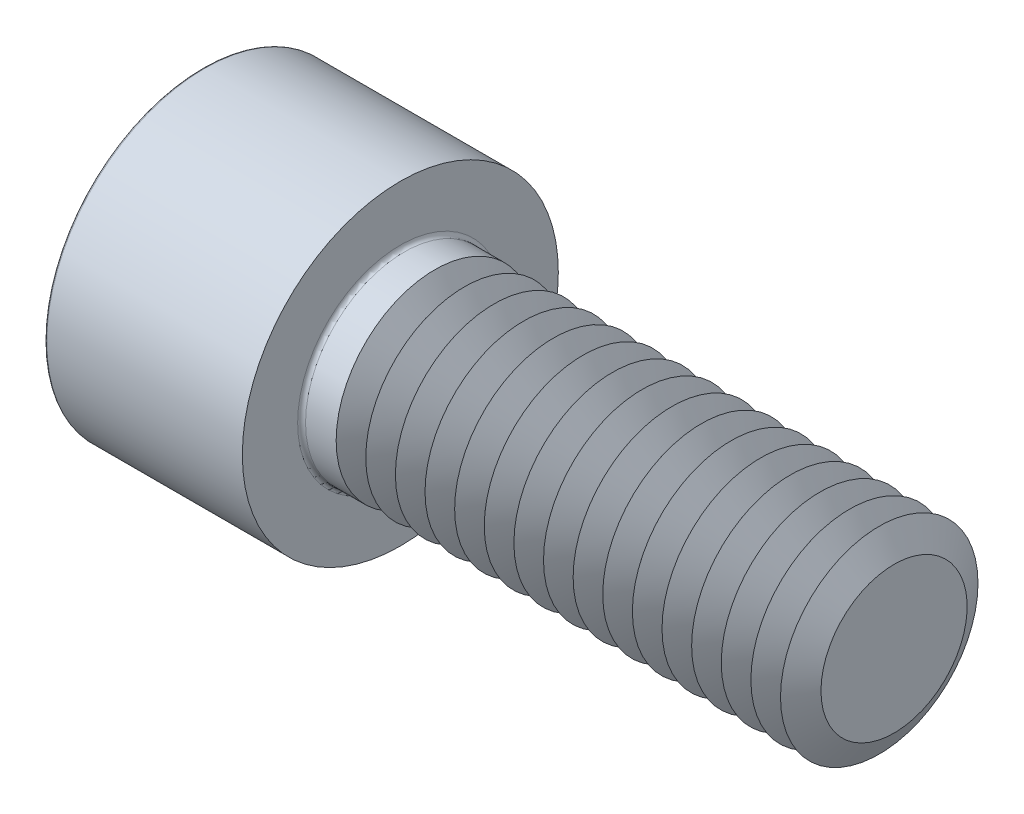
ISO-10303-21;
HEADER;
FILE_DESCRIPTION(('STEP AP214'),'2;1');
FILE_NAME('part.step','',(''),(''),'','','');
FILE_SCHEMA(('AUTOMOTIVE_DESIGN { 1 0 10303 214 1 1 1 1 }'));
ENDSEC;
DATA;
#1=APPLICATION_CONTEXT('core data for automotive mechanical design processes');
#2=APPLICATION_PROTOCOL_DEFINITION('international standard','automotive_design',2000,#1);
#3=PRODUCT_CONTEXT('',#1,'mechanical');
#4=PRODUCT('Part','Part','',(#3));
#5=PRODUCT_RELATED_PRODUCT_CATEGORY('part','',(#4));
#6=PRODUCT_DEFINITION_FORMATION('','',#4);
#7=PRODUCT_DEFINITION_CONTEXT('part definition',#1,'design');
#8=PRODUCT_DEFINITION('design','',#6,#7);
#9=PRODUCT_DEFINITION_SHAPE('','',#8);
#10=(LENGTH_UNIT() NAMED_UNIT(*) SI_UNIT(.MILLI.,.METRE.));
#11=(NAMED_UNIT(*) PLANE_ANGLE_UNIT() SI_UNIT($,.RADIAN.));
#12=(NAMED_UNIT(*) SI_UNIT($,.STERADIAN.) SOLID_ANGLE_UNIT());
#13=UNCERTAINTY_MEASURE_WITH_UNIT(LENGTH_MEASURE(1.E-05),#10,'distance_accuracy_value','');
#14=(GEOMETRIC_REPRESENTATION_CONTEXT(3) GLOBAL_UNCERTAINTY_ASSIGNED_CONTEXT((#13)) GLOBAL_UNIT_ASSIGNED_CONTEXT((#10,
#11,#12)) REPRESENTATION_CONTEXT('',''));
#15=CARTESIAN_POINT('',(0.,0.,0.));
#16=DIRECTION('',(0.,0.,1.));
#17=DIRECTION('',(1.,0.,0.));
#18=AXIS2_PLACEMENT_3D('',#15,#16,#17);
#19=CARTESIAN_POINT('',(0.,0.,0.));
#20=DIRECTION('',(-1.,0.,0.));
#21=DIRECTION('',(0.,0.,1.));
#22=AXIS2_PLACEMENT_3D('',#19,#20,#21);
#23=CYLINDRICAL_SURFACE('',#22,5.);
#24=CARTESIAN_POINT('',(13.2500220003227,0.,0.));
#25=DIRECTION('',(-1.,0.,0.));
#26=DIRECTION('',(0.,0.,1.));
#27=AXIS2_PLACEMENT_3D('',#24,#25,#26);
#28=CIRCLE('',#27,5.);
#29=CARTESIAN_POINT('',(13.2500220003227,0.,5.));
#30=VERTEX_POINT('',#29);
#31=EDGE_CURVE('E356',#30,#30,#28,.T.);
#32=ORIENTED_EDGE('',*,*,#31,.T.);
#33=EDGE_LOOP('',(#32));
#34=FACE_BOUND('',#33,.T.);
#35=CARTESIAN_POINT('',(13.2499779996774,0.,0.));
#36=DIRECTION('',(-1.,0.,0.));
#37=DIRECTION('',(0.,0.,1.));
#38=AXIS2_PLACEMENT_3D('',#35,#36,#37);
#39=CIRCLE('',#38,5.);
#40=CARTESIAN_POINT('',(13.2499779996774,0.,5.));
#41=VERTEX_POINT('',#40);
#42=EDGE_CURVE('E352',#41,#41,#39,.T.);
#43=ORIENTED_EDGE('',*,*,#42,.F.);
#44=EDGE_LOOP('',(#43));
#45=FACE_BOUND('',#44,.T.);
#46=ADVANCED_FACE('F39',(#34,#45),#23,.T.);
#47=CARTESIAN_POINT('',(14.7500220003227,0.,0.));
#48=DIRECTION('',(-1.,0.,0.));
#49=DIRECTION('',(0.,0.,1.));
#50=AXIS2_PLACEMENT_3D('',#47,#48,#49);
#51=CIRCLE('',#50,5.);
#52=CARTESIAN_POINT('',(14.7500220003227,0.,5.));
#53=VERTEX_POINT('',#52);
#54=EDGE_CURVE('E369',#53,#53,#51,.T.);
#55=ORIENTED_EDGE('',*,*,#54,.T.);
#56=EDGE_LOOP('',(#55));
#57=FACE_BOUND('',#56,.T.);
#58=CARTESIAN_POINT('',(14.7499779996773,0.,0.));
#59=DIRECTION('',(-1.,0.,0.));
#60=DIRECTION('',(0.,0.,1.));
#61=AXIS2_PLACEMENT_3D('',#58,#59,#60);
#62=CIRCLE('',#61,5.);
#63=CARTESIAN_POINT('',(14.7499779996773,0.,5.));
#64=VERTEX_POINT('',#63);
#65=EDGE_CURVE('E358',#64,#64,#62,.T.);
#66=ORIENTED_EDGE('',*,*,#65,.F.);
#67=EDGE_LOOP('',(#66));
#68=FACE_BOUND('',#67,.T.);
#69=ADVANCED_FACE('F174',(#57,#68),#23,.T.);
#70=CARTESIAN_POINT('',(16.2500220003227,0.,0.));
#71=DIRECTION('',(-1.,0.,0.));
#72=DIRECTION('',(0.,0.,1.));
#73=AXIS2_PLACEMENT_3D('',#70,#71,#72);
#74=CIRCLE('',#73,5.);
#75=CARTESIAN_POINT('',(16.2500220003227,0.,5.));
#76=VERTEX_POINT('',#75);
#77=EDGE_CURVE('E378',#76,#76,#74,.T.);
#78=ORIENTED_EDGE('',*,*,#77,.T.);
#79=EDGE_LOOP('',(#78));
#80=FACE_BOUND('',#79,.T.);
#81=CARTESIAN_POINT('',(16.2499779996773,0.,0.));
#82=DIRECTION('',(-1.,0.,0.));
#83=DIRECTION('',(0.,0.,1.));
#84=AXIS2_PLACEMENT_3D('',#81,#82,#83);
#85=CIRCLE('',#84,5.);
#86=CARTESIAN_POINT('',(16.2499779996773,0.,5.));
#87=VERTEX_POINT('',#86);
#88=EDGE_CURVE('E372',#87,#87,#85,.T.);
#89=ORIENTED_EDGE('',*,*,#88,.F.);
#90=EDGE_LOOP('',(#89));
#91=FACE_BOUND('',#90,.T.);
#92=ADVANCED_FACE('F179',(#80,#91),#23,.T.);
#93=CARTESIAN_POINT('',(17.7500220003227,0.,0.));
#94=DIRECTION('',(-1.,0.,0.));
#95=DIRECTION('',(0.,0.,1.));
#96=AXIS2_PLACEMENT_3D('',#93,#94,#95);
#97=CIRCLE('',#96,5.);
#98=CARTESIAN_POINT('',(17.7500220003227,0.,5.));
#99=VERTEX_POINT('',#98);
#100=EDGE_CURVE('E387',#99,#99,#97,.T.);
#101=ORIENTED_EDGE('',*,*,#100,.T.);
#102=EDGE_LOOP('',(#101));
#103=FACE_BOUND('',#102,.T.);
#104=CARTESIAN_POINT('',(17.7499779996773,0.,0.));
#105=DIRECTION('',(-1.,0.,0.));
#106=DIRECTION('',(0.,0.,1.));
#107=AXIS2_PLACEMENT_3D('',#104,#105,#106);
#108=CIRCLE('',#107,5.);
#109=CARTESIAN_POINT('',(17.7499779996773,0.,5.));
#110=VERTEX_POINT('',#109);
#111=EDGE_CURVE('E381',#110,#110,#108,.T.);
#112=ORIENTED_EDGE('',*,*,#111,.F.);
#113=EDGE_LOOP('',(#112));
#114=FACE_BOUND('',#113,.T.);
#115=ADVANCED_FACE('F797',(#103,#114),#23,.T.);
#116=CARTESIAN_POINT('',(19.2500220003227,0.,0.));
#117=DIRECTION('',(-1.,0.,0.));
#118=DIRECTION('',(0.,0.,1.));
#119=AXIS2_PLACEMENT_3D('',#116,#117,#118);
#120=CIRCLE('',#119,5.);
#121=CARTESIAN_POINT('',(19.2500220003227,0.,5.));
#122=VERTEX_POINT('',#121);
#123=EDGE_CURVE('E396',#122,#122,#120,.T.);
#124=ORIENTED_EDGE('',*,*,#123,.T.);
#125=EDGE_LOOP('',(#124));
#126=FACE_BOUND('',#125,.T.);
#127=CARTESIAN_POINT('',(19.2499779996773,0.,0.));
#128=DIRECTION('',(-1.,0.,0.));
#129=DIRECTION('',(0.,0.,1.));
#130=AXIS2_PLACEMENT_3D('',#127,#128,#129);
#131=CIRCLE('',#130,5.);
#132=CARTESIAN_POINT('',(19.2499779996773,0.,5.));
#133=VERTEX_POINT('',#132);
#134=EDGE_CURVE('E390',#133,#133,#131,.T.);
#135=ORIENTED_EDGE('',*,*,#134,.F.);
#136=EDGE_LOOP('',(#135));
#137=FACE_BOUND('',#136,.T.);
#138=ADVANCED_FACE('F789',(#126,#137),#23,.T.);
#139=CARTESIAN_POINT('',(20.7500220003227,0.,0.));
#140=DIRECTION('',(-1.,0.,0.));
#141=DIRECTION('',(0.,0.,1.));
#142=AXIS2_PLACEMENT_3D('',#139,#140,#141);
#143=CIRCLE('',#142,5.);
#144=CARTESIAN_POINT('',(20.7500220003227,0.,5.));
#145=VERTEX_POINT('',#144);
#146=EDGE_CURVE('E405',#145,#145,#143,.T.);
#147=ORIENTED_EDGE('',*,*,#146,.T.);
#148=EDGE_LOOP('',(#147));
#149=FACE_BOUND('',#148,.T.);
#150=CARTESIAN_POINT('',(20.7499779996774,0.,0.));
#151=DIRECTION('',(-1.,0.,0.));
#152=DIRECTION('',(0.,0.,1.));
#153=AXIS2_PLACEMENT_3D('',#150,#151,#152);
#154=CIRCLE('',#153,5.);
#155=CARTESIAN_POINT('',(20.7499779996774,0.,5.));
#156=VERTEX_POINT('',#155);
#157=EDGE_CURVE('E399',#156,#156,#154,.T.);
#158=ORIENTED_EDGE('',*,*,#157,.F.);
#159=EDGE_LOOP('',(#158));
#160=FACE_BOUND('',#159,.T.);
#161=ADVANCED_FACE('F781',(#149,#160),#23,.T.);
#162=CARTESIAN_POINT('',(22.2500220003227,0.,0.));
#163=DIRECTION('',(-1.,0.,0.));
#164=DIRECTION('',(0.,0.,1.));
#165=AXIS2_PLACEMENT_3D('',#162,#163,#164);
#166=CIRCLE('',#165,5.);
#167=CARTESIAN_POINT('',(22.2500220003227,0.,5.));
#168=VERTEX_POINT('',#167);
#169=EDGE_CURVE('E414',#168,#168,#166,.T.);
#170=ORIENTED_EDGE('',*,*,#169,.T.);
#171=EDGE_LOOP('',(#170));
#172=FACE_BOUND('',#171,.T.);
#173=CARTESIAN_POINT('',(22.2499779996774,0.,0.));
#174=DIRECTION('',(-1.,0.,0.));
#175=DIRECTION('',(0.,0.,1.));
#176=AXIS2_PLACEMENT_3D('',#173,#174,#175);
#177=CIRCLE('',#176,5.);
#178=CARTESIAN_POINT('',(22.2499779996774,0.,5.));
#179=VERTEX_POINT('',#178);
#180=EDGE_CURVE('E408',#179,#179,#177,.T.);
#181=ORIENTED_EDGE('',*,*,#180,.F.);
#182=EDGE_LOOP('',(#181));
#183=FACE_BOUND('',#182,.T.);
#184=ADVANCED_FACE('F773',(#172,#183),#23,.T.);
#185=CARTESIAN_POINT('',(23.7500220003227,0.,0.));
#186=DIRECTION('',(-1.,0.,0.));
#187=DIRECTION('',(0.,0.,1.));
#188=AXIS2_PLACEMENT_3D('',#185,#186,#187);
#189=CIRCLE('',#188,5.);
#190=CARTESIAN_POINT('',(23.7500220003227,0.,5.));
#191=VERTEX_POINT('',#190);
#192=EDGE_CURVE('E423',#191,#191,#189,.T.);
#193=ORIENTED_EDGE('',*,*,#192,.T.);
#194=EDGE_LOOP('',(#193));
#195=FACE_BOUND('',#194,.T.);
#196=CARTESIAN_POINT('',(23.7499779996773,0.,0.));
#197=DIRECTION('',(-1.,0.,0.));
#198=DIRECTION('',(0.,0.,1.));
#199=AXIS2_PLACEMENT_3D('',#196,#197,#198);
#200=CIRCLE('',#199,5.);
#201=CARTESIAN_POINT('',(23.7499779996773,0.,5.));
#202=VERTEX_POINT('',#201);
#203=EDGE_CURVE('E417',#202,#202,#200,.T.);
#204=ORIENTED_EDGE('',*,*,#203,.F.);
#205=EDGE_LOOP('',(#204));
#206=FACE_BOUND('',#205,.T.);
#207=ADVANCED_FACE('F765',(#195,#206),#23,.T.);
#208=CARTESIAN_POINT('',(25.2500220003227,0.,0.));
#209=DIRECTION('',(-1.,0.,0.));
#210=DIRECTION('',(0.,0.,1.));
#211=AXIS2_PLACEMENT_3D('',#208,#209,#210);
#212=CIRCLE('',#211,5.);
#213=CARTESIAN_POINT('',(25.2500220003227,0.,5.));
#214=VERTEX_POINT('',#213);
#215=EDGE_CURVE('E432',#214,#214,#212,.T.);
#216=ORIENTED_EDGE('',*,*,#215,.T.);
#217=EDGE_LOOP('',(#216));
#218=FACE_BOUND('',#217,.T.);
#219=CARTESIAN_POINT('',(25.2499779996773,0.,0.));
#220=DIRECTION('',(-1.,0.,0.));
#221=DIRECTION('',(0.,0.,1.));
#222=AXIS2_PLACEMENT_3D('',#219,#220,#221);
#223=CIRCLE('',#222,5.);
#224=CARTESIAN_POINT('',(25.2499779996773,0.,5.));
#225=VERTEX_POINT('',#224);
#226=EDGE_CURVE('E426',#225,#225,#223,.T.);
#227=ORIENTED_EDGE('',*,*,#226,.F.);
#228=EDGE_LOOP('',(#227));
#229=FACE_BOUND('',#228,.T.);
#230=ADVANCED_FACE('F757',(#218,#229),#23,.T.);
#231=CARTESIAN_POINT('',(26.7500220003227,0.,0.));
#232=DIRECTION('',(-1.,0.,0.));
#233=DIRECTION('',(0.,0.,1.));
#234=AXIS2_PLACEMENT_3D('',#231,#232,#233);
#235=CIRCLE('',#234,5.);
#236=CARTESIAN_POINT('',(26.7500220003227,0.,5.));
#237=VERTEX_POINT('',#236);
#238=EDGE_CURVE('E441',#237,#237,#235,.T.);
#239=ORIENTED_EDGE('',*,*,#238,.T.);
#240=EDGE_LOOP('',(#239));
#241=FACE_BOUND('',#240,.T.);
#242=CARTESIAN_POINT('',(26.7499779996773,0.,0.));
#243=DIRECTION('',(-1.,0.,0.));
#244=DIRECTION('',(0.,0.,1.));
#245=AXIS2_PLACEMENT_3D('',#242,#243,#244);
#246=CIRCLE('',#245,5.);
#247=CARTESIAN_POINT('',(26.7499779996773,0.,5.));
#248=VERTEX_POINT('',#247);
#249=EDGE_CURVE('E435',#248,#248,#246,.T.);
#250=ORIENTED_EDGE('',*,*,#249,.F.);
#251=EDGE_LOOP('',(#250));
#252=FACE_BOUND('',#251,.T.);
#253=ADVANCED_FACE('F749',(#241,#252),#23,.T.);
#254=CARTESIAN_POINT('',(28.2500220003227,0.,0.));
#255=DIRECTION('',(-1.,0.,0.));
#256=DIRECTION('',(0.,0.,1.));
#257=AXIS2_PLACEMENT_3D('',#254,#255,#256);
#258=CIRCLE('',#257,5.);
#259=CARTESIAN_POINT('',(28.2500220003227,0.,5.));
#260=VERTEX_POINT('',#259);
#261=EDGE_CURVE('E450',#260,#260,#258,.T.);
#262=ORIENTED_EDGE('',*,*,#261,.T.);
#263=EDGE_LOOP('',(#262));
#264=FACE_BOUND('',#263,.T.);
#265=CARTESIAN_POINT('',(28.2499779996774,0.,0.));
#266=DIRECTION('',(-1.,0.,0.));
#267=DIRECTION('',(0.,0.,1.));
#268=AXIS2_PLACEMENT_3D('',#265,#266,#267);
#269=CIRCLE('',#268,5.);
#270=CARTESIAN_POINT('',(28.2499779996774,0.,5.));
#271=VERTEX_POINT('',#270);
#272=EDGE_CURVE('E444',#271,#271,#269,.T.);
#273=ORIENTED_EDGE('',*,*,#272,.F.);
#274=EDGE_LOOP('',(#273));
#275=FACE_BOUND('',#274,.T.);
#276=ADVANCED_FACE('F741',(#264,#275),#23,.T.);
#277=CARTESIAN_POINT('',(29.7500220003227,0.,0.));
#278=DIRECTION('',(-1.,0.,0.));
#279=DIRECTION('',(0.,0.,1.));
#280=AXIS2_PLACEMENT_3D('',#277,#278,#279);
#281=CIRCLE('',#280,5.);
#282=CARTESIAN_POINT('',(29.7500220003227,0.,5.));
#283=VERTEX_POINT('',#282);
#284=EDGE_CURVE('E459',#283,#283,#281,.T.);
#285=ORIENTED_EDGE('',*,*,#284,.T.);
#286=EDGE_LOOP('',(#285));
#287=FACE_BOUND('',#286,.T.);
#288=CARTESIAN_POINT('',(29.7499779996774,0.,0.));
#289=DIRECTION('',(-1.,0.,0.));
#290=DIRECTION('',(0.,0.,1.));
#291=AXIS2_PLACEMENT_3D('',#288,#289,#290);
#292=CIRCLE('',#291,5.);
#293=CARTESIAN_POINT('',(29.7499779996774,0.,5.));
#294=VERTEX_POINT('',#293);
#295=EDGE_CURVE('E453',#294,#294,#292,.T.);
#296=ORIENTED_EDGE('',*,*,#295,.F.);
#297=EDGE_LOOP('',(#296));
#298=FACE_BOUND('',#297,.T.);
#299=ADVANCED_FACE('F732',(#287,#298),#23,.T.);
#300=CARTESIAN_POINT('',(31.2500220003227,0.,0.));
#301=DIRECTION('',(-1.,0.,0.));
#302=DIRECTION('',(0.,0.,1.));
#303=AXIS2_PLACEMENT_3D('',#300,#301,#302);
#304=CIRCLE('',#303,5.);
#305=CARTESIAN_POINT('',(31.2500220003227,0.,5.));
#306=VERTEX_POINT('',#305);
#307=EDGE_CURVE('E468',#306,#306,#304,.T.);
#308=ORIENTED_EDGE('',*,*,#307,.T.);
#309=EDGE_LOOP('',(#308));
#310=FACE_BOUND('',#309,.T.);
#311=CARTESIAN_POINT('',(31.2499779996773,0.,0.));
#312=DIRECTION('',(-1.,0.,0.));
#313=DIRECTION('',(0.,0.,1.));
#314=AXIS2_PLACEMENT_3D('',#311,#312,#313);
#315=CIRCLE('',#314,5.);
#316=CARTESIAN_POINT('',(31.2499779996773,0.,5.));
#317=VERTEX_POINT('',#316);
#318=EDGE_CURVE('E462',#317,#317,#315,.T.);
#319=ORIENTED_EDGE('',*,*,#318,.F.);
#320=EDGE_LOOP('',(#319));
#321=FACE_BOUND('',#320,.T.);
#322=ADVANCED_FACE('F240',(#310,#321),#23,.T.);
#323=CARTESIAN_POINT('',(31.2500220003227,0.,0.));
#324=DIRECTION('',(-1.,0.,0.));
#325=DIRECTION('',(0.,0.,1.));
#326=AXIS2_PLACEMENT_3D('',#323,#324,#325);
#327=CONICAL_SURFACE('',#326,5.,1.04719755119658);
#328=CARTESIAN_POINT('',(32.,0.,0.));
#329=DIRECTION('',(-1.,0.,0.));
#330=DIRECTION('',(0.,0.,1.));
#331=AXIS2_PLACEMENT_3D('',#328,#329,#330);
#332=CIRCLE('',#331,3.701);
#333=CARTESIAN_POINT('',(32.,0.,3.701));
#334=VERTEX_POINT('',#333);
#335=EDGE_CURVE('E474',#334,#334,#332,.T.);
#336=ORIENTED_EDGE('',*,*,#335,.T.);
#337=EDGE_LOOP('',(#336));
#338=FACE_BOUND('',#337,.T.);
#339=ORIENTED_EDGE('',*,*,#307,.F.);
#340=EDGE_LOOP('',(#339));
#341=FACE_BOUND('',#340,.T.);
#342=ADVANCED_FACE('F236',(#338,#341),#327,.T.);
#343=CARTESIAN_POINT('',(32.,0.,0.));
#344=DIRECTION('',(1.,0.,0.));
#345=DIRECTION('',(0.,0.,-1.));
#346=AXIS2_PLACEMENT_3D('',#343,#344,#345);
#347=CONICAL_SURFACE('',#346,3.701,1.04719755119658);
#348=CARTESIAN_POINT('',(32.7499779996773,0.,0.));
#349=DIRECTION('',(-1.,0.,0.));
#350=DIRECTION('',(0.,0.,1.));
#351=AXIS2_PLACEMENT_3D('',#348,#349,#350);
#352=CIRCLE('',#351,5.);
#353=CARTESIAN_POINT('',(32.7499779996773,0.,5.));
#354=VERTEX_POINT('',#353);
#355=EDGE_CURVE('E471',#354,#354,#352,.T.);
#356=ORIENTED_EDGE('',*,*,#355,.T.);
#357=EDGE_LOOP('',(#356));
#358=FACE_BOUND('',#357,.T.);
#359=ORIENTED_EDGE('',*,*,#335,.F.);
#360=EDGE_LOOP('',(#359));
#361=FACE_BOUND('',#360,.T.);
#362=ADVANCED_FACE('F239',(#358,#361),#347,.T.);
#363=CARTESIAN_POINT('',(35.,5.,0.));
#364=DIRECTION('',(-1.,0.,0.));
#365=DIRECTION('',(0.,0.,1.));
#366=AXIS2_PLACEMENT_3D('',#363,#364,#365);
#367=PLANE('',#366);
#368=CARTESIAN_POINT('',(35.,0.,0.));
#369=DIRECTION('',(-1.,0.,0.));
#370=DIRECTION('',(0.,0.,1.));
#371=AXIS2_PLACEMENT_3D('',#368,#369,#370);
#372=CIRCLE('',#371,3.701);
#373=CARTESIAN_POINT('',(35.,0.,3.701));
#374=VERTEX_POINT('',#373);
#375=EDGE_CURVE('E129',#374,#374,#372,.T.);
#376=ORIENTED_EDGE('',*,*,#375,.F.);
#377=EDGE_LOOP('',(#376));
#378=FACE_BOUND('',#377,.T.);
#379=ADVANCED_FACE('F185',(#378),#367,.F.);
#380=CARTESIAN_POINT('',(34.2500220003227,0.,0.));
#381=DIRECTION('',(-1.,0.,0.));
#382=DIRECTION('',(0.,0.,1.));
#383=AXIS2_PLACEMENT_3D('',#380,#381,#382);
#384=CONICAL_SURFACE('',#383,5.,1.04719755119658);
#385=ORIENTED_EDGE('',*,*,#375,.T.);
#386=EDGE_LOOP('',(#385));
#387=FACE_BOUND('',#386,.T.);
#388=CARTESIAN_POINT('',(34.2500220003227,0.,0.));
#389=DIRECTION('',(-1.,0.,0.));
#390=DIRECTION('',(0.,0.,1.));
#391=AXIS2_PLACEMENT_3D('',#388,#389,#390);
#392=CIRCLE('',#391,5.);
#393=CARTESIAN_POINT('',(34.2500220003227,0.,5.));
#394=VERTEX_POINT('',#393);
#395=EDGE_CURVE('E486',#394,#394,#392,.T.);
#396=ORIENTED_EDGE('',*,*,#395,.F.);
#397=EDGE_LOOP('',(#396));
#398=FACE_BOUND('',#397,.T.);
#399=ADVANCED_FACE('F223',(#387,#398),#384,.T.);
#400=ORIENTED_EDGE('',*,*,#395,.T.);
#401=EDGE_LOOP('',(#400));
#402=FACE_BOUND('',#401,.T.);
#403=CARTESIAN_POINT('',(34.2499779996773,0.,0.));
#404=DIRECTION('',(-1.,0.,0.));
#405=DIRECTION('',(0.,0.,1.));
#406=AXIS2_PLACEMENT_3D('',#403,#404,#405);
#407=CIRCLE('',#406,5.);
#408=CARTESIAN_POINT('',(34.2499779996773,0.,5.));
#409=VERTEX_POINT('',#408);
#410=EDGE_CURVE('E480',#409,#409,#407,.T.);
#411=ORIENTED_EDGE('',*,*,#410,.F.);
#412=EDGE_LOOP('',(#411));
#413=FACE_BOUND('',#412,.T.);
#414=ADVANCED_FACE('F171',(#402,#413),#23,.T.);
#415=CARTESIAN_POINT('',(33.5,0.,0.));
#416=DIRECTION('',(1.,0.,0.));
#417=DIRECTION('',(0.,0.,-1.));
#418=AXIS2_PLACEMENT_3D('',#415,#416,#417);
#419=CONICAL_SURFACE('',#418,3.701,1.04719755119658);
#420=ORIENTED_EDGE('',*,*,#410,.T.);
#421=EDGE_LOOP('',(#420));
#422=FACE_BOUND('',#421,.T.);
#423=CARTESIAN_POINT('',(33.5,0.,0.));
#424=DIRECTION('',(-1.,0.,0.));
#425=DIRECTION('',(0.,0.,1.));
#426=AXIS2_PLACEMENT_3D('',#423,#424,#425);
#427=CIRCLE('',#426,3.701);
#428=CARTESIAN_POINT('',(33.5,0.,3.701));
#429=VERTEX_POINT('',#428);
#430=EDGE_CURVE('E483',#429,#429,#427,.T.);
#431=ORIENTED_EDGE('',*,*,#430,.F.);
#432=EDGE_LOOP('',(#431));
#433=FACE_BOUND('',#432,.T.);
#434=ADVANCED_FACE('F231',(#422,#433),#419,.T.);
#435=CARTESIAN_POINT('',(32.7500220003227,0.,0.));
#436=DIRECTION('',(-1.,0.,0.));
#437=DIRECTION('',(0.,0.,1.));
#438=AXIS2_PLACEMENT_3D('',#435,#436,#437);
#439=CONICAL_SURFACE('',#438,5.,1.04719755119658);
#440=ORIENTED_EDGE('',*,*,#430,.T.);
#441=EDGE_LOOP('',(#440));
#442=FACE_BOUND('',#441,.T.);
#443=CARTESIAN_POINT('',(32.7500220003227,0.,0.));
#444=DIRECTION('',(-1.,0.,0.));
#445=DIRECTION('',(0.,0.,1.));
#446=AXIS2_PLACEMENT_3D('',#443,#444,#445);
#447=CIRCLE('',#446,5.);
#448=CARTESIAN_POINT('',(32.7500220003227,0.,5.));
#449=VERTEX_POINT('',#448);
#450=EDGE_CURVE('E477',#449,#449,#447,.T.);
#451=ORIENTED_EDGE('',*,*,#450,.F.);
#452=EDGE_LOOP('',(#451));
#453=FACE_BOUND('',#452,.T.);
#454=ADVANCED_FACE('F227',(#442,#453),#439,.T.);
#455=ORIENTED_EDGE('',*,*,#450,.T.);
#456=EDGE_LOOP('',(#455));
#457=FACE_BOUND('',#456,.T.);
#458=ORIENTED_EDGE('',*,*,#355,.F.);
#459=EDGE_LOOP('',(#458));
#460=FACE_BOUND('',#459,.T.);
#461=ADVANCED_FACE('F230',(#457,#460),#23,.T.);
#462=CARTESIAN_POINT('',(29.7500220003227,0.,0.));
#463=DIRECTION('',(-1.,0.,0.));
#464=DIRECTION('',(0.,0.,1.));
#465=AXIS2_PLACEMENT_3D('',#462,#463,#464);
#466=CONICAL_SURFACE('',#465,5.,1.04719755119658);
#467=CARTESIAN_POINT('',(30.5,0.,0.));
#468=DIRECTION('',(-1.,0.,0.));
#469=DIRECTION('',(0.,0.,1.));
#470=AXIS2_PLACEMENT_3D('',#467,#468,#469);
#471=CIRCLE('',#470,3.701);
#472=CARTESIAN_POINT('',(30.5,0.,3.701));
#473=VERTEX_POINT('',#472);
#474=EDGE_CURVE('E465',#473,#473,#471,.T.);
#475=ORIENTED_EDGE('',*,*,#474,.T.);
#476=EDGE_LOOP('',(#475));
#477=FACE_BOUND('',#476,.T.);
#478=ORIENTED_EDGE('',*,*,#284,.F.);
#479=EDGE_LOOP('',(#478));
#480=FACE_BOUND('',#479,.T.);
#481=ADVANCED_FACE('F245',(#477,#480),#466,.T.);
#482=CARTESIAN_POINT('',(30.5,0.,0.));
#483=DIRECTION('',(1.,0.,0.));
#484=DIRECTION('',(0.,0.,-1.));
#485=AXIS2_PLACEMENT_3D('',#482,#483,#484);
#486=CONICAL_SURFACE('',#485,3.701,1.04719755119658);
#487=ORIENTED_EDGE('',*,*,#318,.T.);
#488=EDGE_LOOP('',(#487));
#489=FACE_BOUND('',#488,.T.);
#490=ORIENTED_EDGE('',*,*,#474,.F.);
#491=EDGE_LOOP('',(#490));
#492=FACE_BOUND('',#491,.T.);
#493=ADVANCED_FACE('F248',(#489,#492),#486,.T.);
#494=CARTESIAN_POINT('',(28.2500220003227,0.,0.));
#495=DIRECTION('',(-1.,0.,0.));
#496=DIRECTION('',(0.,0.,1.));
#497=AXIS2_PLACEMENT_3D('',#494,#495,#496);
#498=CONICAL_SURFACE('',#497,5.,1.04719755119658);
#499=CARTESIAN_POINT('',(29.,0.,0.));
#500=DIRECTION('',(-1.,0.,0.));
#501=DIRECTION('',(0.,0.,1.));
#502=AXIS2_PLACEMENT_3D('',#499,#500,#501);
#503=CIRCLE('',#502,3.701);
#504=CARTESIAN_POINT('',(29.,0.,3.701));
#505=VERTEX_POINT('',#504);
#506=EDGE_CURVE('E456',#505,#505,#503,.T.);
#507=ORIENTED_EDGE('',*,*,#506,.T.);
#508=EDGE_LOOP('',(#507));
#509=FACE_BOUND('',#508,.T.);
#510=ORIENTED_EDGE('',*,*,#261,.F.);
#511=EDGE_LOOP('',(#510));
#512=FACE_BOUND('',#511,.T.);
#513=ADVANCED_FACE('F252',(#509,#512),#498,.T.);
#514=CARTESIAN_POINT('',(29.,0.,0.));
#515=DIRECTION('',(1.,0.,0.));
#516=DIRECTION('',(0.,0.,-1.));
#517=AXIS2_PLACEMENT_3D('',#514,#515,#516);
#518=CONICAL_SURFACE('',#517,3.701,1.04719755119658);
#519=ORIENTED_EDGE('',*,*,#295,.T.);
#520=EDGE_LOOP('',(#519));
#521=FACE_BOUND('',#520,.T.);
#522=ORIENTED_EDGE('',*,*,#506,.F.);
#523=EDGE_LOOP('',(#522));
#524=FACE_BOUND('',#523,.T.);
#525=ADVANCED_FACE('F256',(#521,#524),#518,.T.);
#526=CARTESIAN_POINT('',(26.7500220003227,0.,0.));
#527=DIRECTION('',(-1.,0.,0.));
#528=DIRECTION('',(0.,0.,1.));
#529=AXIS2_PLACEMENT_3D('',#526,#527,#528);
#530=CONICAL_SURFACE('',#529,5.,1.04719755119658);
#531=CARTESIAN_POINT('',(27.5,0.,0.));
#532=DIRECTION('',(-1.,0.,0.));
#533=DIRECTION('',(0.,0.,1.));
#534=AXIS2_PLACEMENT_3D('',#531,#532,#533);
#535=CIRCLE('',#534,3.701);
#536=CARTESIAN_POINT('',(27.5,0.,3.701));
#537=VERTEX_POINT('',#536);
#538=EDGE_CURVE('E447',#537,#537,#535,.T.);
#539=ORIENTED_EDGE('',*,*,#538,.T.);
#540=EDGE_LOOP('',(#539));
#541=FACE_BOUND('',#540,.T.);
#542=ORIENTED_EDGE('',*,*,#238,.F.);
#543=EDGE_LOOP('',(#542));
#544=FACE_BOUND('',#543,.T.);
#545=ADVANCED_FACE('F260',(#541,#544),#530,.T.);
#546=CARTESIAN_POINT('',(27.5,0.,0.));
#547=DIRECTION('',(1.,0.,0.));
#548=DIRECTION('',(0.,0.,-1.));
#549=AXIS2_PLACEMENT_3D('',#546,#547,#548);
#550=CONICAL_SURFACE('',#549,3.701,1.04719755119658);
#551=ORIENTED_EDGE('',*,*,#272,.T.);
#552=EDGE_LOOP('',(#551));
#553=FACE_BOUND('',#552,.T.);
#554=ORIENTED_EDGE('',*,*,#538,.F.);
#555=EDGE_LOOP('',(#554));
#556=FACE_BOUND('',#555,.T.);
#557=ADVANCED_FACE('F264',(#553,#556),#550,.T.);
#558=CARTESIAN_POINT('',(25.2500220003227,0.,0.));
#559=DIRECTION('',(-1.,0.,0.));
#560=DIRECTION('',(0.,0.,1.));
#561=AXIS2_PLACEMENT_3D('',#558,#559,#560);
#562=CONICAL_SURFACE('',#561,5.,1.04719755119658);
#563=CARTESIAN_POINT('',(26.,0.,0.));
#564=DIRECTION('',(-1.,0.,0.));
#565=DIRECTION('',(0.,0.,1.));
#566=AXIS2_PLACEMENT_3D('',#563,#564,#565);
#567=CIRCLE('',#566,3.701);
#568=CARTESIAN_POINT('',(26.,0.,3.701));
#569=VERTEX_POINT('',#568);
#570=EDGE_CURVE('E438',#569,#569,#567,.T.);
#571=ORIENTED_EDGE('',*,*,#570,.T.);
#572=EDGE_LOOP('',(#571));
#573=FACE_BOUND('',#572,.T.);
#574=ORIENTED_EDGE('',*,*,#215,.F.);
#575=EDGE_LOOP('',(#574));
#576=FACE_BOUND('',#575,.T.);
#577=ADVANCED_FACE('F268',(#573,#576),#562,.T.);
#578=CARTESIAN_POINT('',(26.,0.,0.));
#579=DIRECTION('',(1.,0.,0.));
#580=DIRECTION('',(0.,0.,-1.));
#581=AXIS2_PLACEMENT_3D('',#578,#579,#580);
#582=CONICAL_SURFACE('',#581,3.701,1.04719755119658);
#583=ORIENTED_EDGE('',*,*,#249,.T.);
#584=EDGE_LOOP('',(#583));
#585=FACE_BOUND('',#584,.T.);
#586=ORIENTED_EDGE('',*,*,#570,.F.);
#587=EDGE_LOOP('',(#586));
#588=FACE_BOUND('',#587,.T.);
#589=ADVANCED_FACE('F272',(#585,#588),#582,.T.);
#590=CARTESIAN_POINT('',(23.7500220003227,0.,0.));
#591=DIRECTION('',(-1.,0.,0.));
#592=DIRECTION('',(0.,0.,1.));
#593=AXIS2_PLACEMENT_3D('',#590,#591,#592);
#594=CONICAL_SURFACE('',#593,5.,1.04719755119658);
#595=CARTESIAN_POINT('',(24.5,0.,0.));
#596=DIRECTION('',(-1.,0.,0.));
#597=DIRECTION('',(0.,0.,1.));
#598=AXIS2_PLACEMENT_3D('',#595,#596,#597);
#599=CIRCLE('',#598,3.701);
#600=CARTESIAN_POINT('',(24.5,0.,3.701));
#601=VERTEX_POINT('',#600);
#602=EDGE_CURVE('E429',#601,#601,#599,.T.);
#603=ORIENTED_EDGE('',*,*,#602,.T.);
#604=EDGE_LOOP('',(#603));
#605=FACE_BOUND('',#604,.T.);
#606=ORIENTED_EDGE('',*,*,#192,.F.);
#607=EDGE_LOOP('',(#606));
#608=FACE_BOUND('',#607,.T.);
#609=ADVANCED_FACE('F276',(#605,#608),#594,.T.);
#610=CARTESIAN_POINT('',(24.5,0.,0.));
#611=DIRECTION('',(1.,0.,0.));
#612=DIRECTION('',(0.,0.,-1.));
#613=AXIS2_PLACEMENT_3D('',#610,#611,#612);
#614=CONICAL_SURFACE('',#613,3.701,1.04719755119658);
#615=ORIENTED_EDGE('',*,*,#226,.T.);
#616=EDGE_LOOP('',(#615));
#617=FACE_BOUND('',#616,.T.);
#618=ORIENTED_EDGE('',*,*,#602,.F.);
#619=EDGE_LOOP('',(#618));
#620=FACE_BOUND('',#619,.T.);
#621=ADVANCED_FACE('F280',(#617,#620),#614,.T.);
#622=CARTESIAN_POINT('',(22.2500220003227,0.,0.));
#623=DIRECTION('',(-1.,0.,0.));
#624=DIRECTION('',(0.,0.,1.));
#625=AXIS2_PLACEMENT_3D('',#622,#623,#624);
#626=CONICAL_SURFACE('',#625,5.,1.04719755119658);
#627=CARTESIAN_POINT('',(23.,0.,0.));
#628=DIRECTION('',(-1.,0.,0.));
#629=DIRECTION('',(0.,0.,1.));
#630=AXIS2_PLACEMENT_3D('',#627,#628,#629);
#631=CIRCLE('',#630,3.701);
#632=CARTESIAN_POINT('',(23.,0.,3.701));
#633=VERTEX_POINT('',#632);
#634=EDGE_CURVE('E420',#633,#633,#631,.T.);
#635=ORIENTED_EDGE('',*,*,#634,.T.);
#636=EDGE_LOOP('',(#635));
#637=FACE_BOUND('',#636,.T.);
#638=ORIENTED_EDGE('',*,*,#169,.F.);
#639=EDGE_LOOP('',(#638));
#640=FACE_BOUND('',#639,.T.);
#641=ADVANCED_FACE('F284',(#637,#640),#626,.T.);
#642=CARTESIAN_POINT('',(23.,0.,0.));
#643=DIRECTION('',(1.,0.,0.));
#644=DIRECTION('',(0.,0.,-1.));
#645=AXIS2_PLACEMENT_3D('',#642,#643,#644);
#646=CONICAL_SURFACE('',#645,3.701,1.04719755119658);
#647=ORIENTED_EDGE('',*,*,#203,.T.);
#648=EDGE_LOOP('',(#647));
#649=FACE_BOUND('',#648,.T.);
#650=ORIENTED_EDGE('',*,*,#634,.F.);
#651=EDGE_LOOP('',(#650));
#652=FACE_BOUND('',#651,.T.);
#653=ADVANCED_FACE('F288',(#649,#652),#646,.T.);
#654=CARTESIAN_POINT('',(20.7500220003227,0.,0.));
#655=DIRECTION('',(-1.,0.,0.));
#656=DIRECTION('',(0.,0.,1.));
#657=AXIS2_PLACEMENT_3D('',#654,#655,#656);
#658=CONICAL_SURFACE('',#657,5.,1.04719755119658);
#659=CARTESIAN_POINT('',(21.5,0.,0.));
#660=DIRECTION('',(-1.,0.,0.));
#661=DIRECTION('',(0.,0.,1.));
#662=AXIS2_PLACEMENT_3D('',#659,#660,#661);
#663=CIRCLE('',#662,3.701);
#664=CARTESIAN_POINT('',(21.5,0.,3.701));
#665=VERTEX_POINT('',#664);
#666=EDGE_CURVE('E411',#665,#665,#663,.T.);
#667=ORIENTED_EDGE('',*,*,#666,.T.);
#668=EDGE_LOOP('',(#667));
#669=FACE_BOUND('',#668,.T.);
#670=ORIENTED_EDGE('',*,*,#146,.F.);
#671=EDGE_LOOP('',(#670));
#672=FACE_BOUND('',#671,.T.);
#673=ADVANCED_FACE('F292',(#669,#672),#658,.T.);
#674=CARTESIAN_POINT('',(21.5,0.,0.));
#675=DIRECTION('',(1.,0.,0.));
#676=DIRECTION('',(0.,0.,-1.));
#677=AXIS2_PLACEMENT_3D('',#674,#675,#676);
#678=CONICAL_SURFACE('',#677,3.701,1.04719755119658);
#679=ORIENTED_EDGE('',*,*,#180,.T.);
#680=EDGE_LOOP('',(#679));
#681=FACE_BOUND('',#680,.T.);
#682=ORIENTED_EDGE('',*,*,#666,.F.);
#683=EDGE_LOOP('',(#682));
#684=FACE_BOUND('',#683,.T.);
#685=ADVANCED_FACE('F296',(#681,#684),#678,.T.);
#686=CARTESIAN_POINT('',(19.2500220003227,0.,0.));
#687=DIRECTION('',(-1.,0.,0.));
#688=DIRECTION('',(0.,0.,1.));
#689=AXIS2_PLACEMENT_3D('',#686,#687,#688);
#690=CONICAL_SURFACE('',#689,5.,1.04719755119658);
#691=CARTESIAN_POINT('',(20.,0.,0.));
#692=DIRECTION('',(-1.,0.,0.));
#693=DIRECTION('',(0.,0.,1.));
#694=AXIS2_PLACEMENT_3D('',#691,#692,#693);
#695=CIRCLE('',#694,3.701);
#696=CARTESIAN_POINT('',(20.,0.,3.701));
#697=VERTEX_POINT('',#696);
#698=EDGE_CURVE('E402',#697,#697,#695,.T.);
#699=ORIENTED_EDGE('',*,*,#698,.T.);
#700=EDGE_LOOP('',(#699));
#701=FACE_BOUND('',#700,.T.);
#702=ORIENTED_EDGE('',*,*,#123,.F.);
#703=EDGE_LOOP('',(#702));
#704=FACE_BOUND('',#703,.T.);
#705=ADVANCED_FACE('F300',(#701,#704),#690,.T.);
#706=CARTESIAN_POINT('',(20.,0.,0.));
#707=DIRECTION('',(1.,0.,0.));
#708=DIRECTION('',(0.,0.,-1.));
#709=AXIS2_PLACEMENT_3D('',#706,#707,#708);
#710=CONICAL_SURFACE('',#709,3.701,1.04719755119658);
#711=ORIENTED_EDGE('',*,*,#157,.T.);
#712=EDGE_LOOP('',(#711));
#713=FACE_BOUND('',#712,.T.);
#714=ORIENTED_EDGE('',*,*,#698,.F.);
#715=EDGE_LOOP('',(#714));
#716=FACE_BOUND('',#715,.T.);
#717=ADVANCED_FACE('F304',(#713,#716),#710,.T.);
#718=CARTESIAN_POINT('',(17.7500220003227,0.,0.));
#719=DIRECTION('',(-1.,0.,0.));
#720=DIRECTION('',(0.,0.,1.));
#721=AXIS2_PLACEMENT_3D('',#718,#719,#720);
#722=CONICAL_SURFACE('',#721,5.,1.04719755119658);
#723=CARTESIAN_POINT('',(18.5,0.,0.));
#724=DIRECTION('',(-1.,0.,0.));
#725=DIRECTION('',(0.,0.,1.));
#726=AXIS2_PLACEMENT_3D('',#723,#724,#725);
#727=CIRCLE('',#726,3.701);
#728=CARTESIAN_POINT('',(18.5,0.,3.701));
#729=VERTEX_POINT('',#728);
#730=EDGE_CURVE('E393',#729,#729,#727,.T.);
#731=ORIENTED_EDGE('',*,*,#730,.T.);
#732=EDGE_LOOP('',(#731));
#733=FACE_BOUND('',#732,.T.);
#734=ORIENTED_EDGE('',*,*,#100,.F.);
#735=EDGE_LOOP('',(#734));
#736=FACE_BOUND('',#735,.T.);
#737=ADVANCED_FACE('F308',(#733,#736),#722,.T.);
#738=CARTESIAN_POINT('',(18.5,0.,0.));
#739=DIRECTION('',(1.,0.,0.));
#740=DIRECTION('',(0.,0.,-1.));
#741=AXIS2_PLACEMENT_3D('',#738,#739,#740);
#742=CONICAL_SURFACE('',#741,3.701,1.04719755119658);
#743=ORIENTED_EDGE('',*,*,#134,.T.);
#744=EDGE_LOOP('',(#743));
#745=FACE_BOUND('',#744,.T.);
#746=ORIENTED_EDGE('',*,*,#730,.F.);
#747=EDGE_LOOP('',(#746));
#748=FACE_BOUND('',#747,.T.);
#749=ADVANCED_FACE('F312',(#745,#748),#742,.T.);
#750=CARTESIAN_POINT('',(16.2500220003227,0.,0.));
#751=DIRECTION('',(-1.,0.,0.));
#752=DIRECTION('',(0.,0.,1.));
#753=AXIS2_PLACEMENT_3D('',#750,#751,#752);
#754=CONICAL_SURFACE('',#753,5.,1.04719755119658);
#755=CARTESIAN_POINT('',(17.,0.,0.));
#756=DIRECTION('',(-1.,0.,0.));
#757=DIRECTION('',(0.,0.,1.));
#758=AXIS2_PLACEMENT_3D('',#755,#756,#757);
#759=CIRCLE('',#758,3.701);
#760=CARTESIAN_POINT('',(17.,0.,3.701));
#761=VERTEX_POINT('',#760);
#762=EDGE_CURVE('E384',#761,#761,#759,.T.);
#763=ORIENTED_EDGE('',*,*,#762,.T.);
#764=EDGE_LOOP('',(#763));
#765=FACE_BOUND('',#764,.T.);
#766=ORIENTED_EDGE('',*,*,#77,.F.);
#767=EDGE_LOOP('',(#766));
#768=FACE_BOUND('',#767,.T.);
#769=ADVANCED_FACE('F316',(#765,#768),#754,.T.);
#770=CARTESIAN_POINT('',(17.,0.,0.));
#771=DIRECTION('',(1.,0.,0.));
#772=DIRECTION('',(0.,0.,-1.));
#773=AXIS2_PLACEMENT_3D('',#770,#771,#772);
#774=CONICAL_SURFACE('',#773,3.701,1.04719755119658);
#775=ORIENTED_EDGE('',*,*,#111,.T.);
#776=EDGE_LOOP('',(#775));
#777=FACE_BOUND('',#776,.T.);
#778=ORIENTED_EDGE('',*,*,#762,.F.);
#779=EDGE_LOOP('',(#778));
#780=FACE_BOUND('',#779,.T.);
#781=ADVANCED_FACE('F320',(#777,#780),#774,.T.);
#782=CARTESIAN_POINT('',(14.7500220003227,0.,0.));
#783=DIRECTION('',(-1.,0.,0.));
#784=DIRECTION('',(0.,0.,1.));
#785=AXIS2_PLACEMENT_3D('',#782,#783,#784);
#786=CONICAL_SURFACE('',#785,5.,1.04719755119658);
#787=CARTESIAN_POINT('',(15.5,0.,0.));
#788=DIRECTION('',(-1.,0.,0.));
#789=DIRECTION('',(0.,0.,1.));
#790=AXIS2_PLACEMENT_3D('',#787,#788,#789);
#791=CIRCLE('',#790,3.701);
#792=CARTESIAN_POINT('',(15.5,0.,3.701));
#793=VERTEX_POINT('',#792);
#794=EDGE_CURVE('E375',#793,#793,#791,.T.);
#795=ORIENTED_EDGE('',*,*,#794,.T.);
#796=EDGE_LOOP('',(#795));
#797=FACE_BOUND('',#796,.T.);
#798=ORIENTED_EDGE('',*,*,#54,.F.);
#799=EDGE_LOOP('',(#798));
#800=FACE_BOUND('',#799,.T.);
#801=ADVANCED_FACE('F324',(#797,#800),#786,.T.);
#802=CARTESIAN_POINT('',(15.5,0.,0.));
#803=DIRECTION('',(1.,0.,0.));
#804=DIRECTION('',(0.,0.,-1.));
#805=AXIS2_PLACEMENT_3D('',#802,#803,#804);
#806=CONICAL_SURFACE('',#805,3.701,1.04719755119658);
#807=ORIENTED_EDGE('',*,*,#88,.T.);
#808=EDGE_LOOP('',(#807));
#809=FACE_BOUND('',#808,.T.);
#810=ORIENTED_EDGE('',*,*,#794,.F.);
#811=EDGE_LOOP('',(#810));
#812=FACE_BOUND('',#811,.T.);
#813=ADVANCED_FACE('F328',(#809,#812),#806,.T.);
#814=CARTESIAN_POINT('',(13.2500220003227,0.,0.));
#815=DIRECTION('',(-1.,0.,0.));
#816=DIRECTION('',(0.,0.,1.));
#817=AXIS2_PLACEMENT_3D('',#814,#815,#816);
#818=CONICAL_SURFACE('',#817,5.,1.04719755119658);
#819=CARTESIAN_POINT('',(14.,0.,0.));
#820=DIRECTION('',(-1.,0.,0.));
#821=DIRECTION('',(0.,0.,1.));
#822=AXIS2_PLACEMENT_3D('',#819,#820,#821);
#823=CIRCLE('',#822,3.701);
#824=CARTESIAN_POINT('',(14.,0.,3.701));
#825=VERTEX_POINT('',#824);
#826=EDGE_CURVE('E366',#825,#825,#823,.T.);
#827=ORIENTED_EDGE('',*,*,#826,.T.);
#828=EDGE_LOOP('',(#827));
#829=FACE_BOUND('',#828,.T.);
#830=ORIENTED_EDGE('',*,*,#31,.F.);
#831=EDGE_LOOP('',(#830));
#832=FACE_BOUND('',#831,.T.);
#833=ADVANCED_FACE('F332',(#829,#832),#818,.T.);
#834=CARTESIAN_POINT('',(14.,0.,0.));
#835=DIRECTION('',(1.,0.,0.));
#836=DIRECTION('',(0.,0.,-1.));
#837=AXIS2_PLACEMENT_3D('',#834,#835,#836);
#838=CONICAL_SURFACE('',#837,3.701,1.04719755119658);
#839=ORIENTED_EDGE('',*,*,#65,.T.);
#840=EDGE_LOOP('',(#839));
#841=FACE_BOUND('',#840,.T.);
#842=ORIENTED_EDGE('',*,*,#826,.F.);
#843=EDGE_LOOP('',(#842));
#844=FACE_BOUND('',#843,.T.);
#845=ADVANCED_FACE('F336',(#841,#844),#838,.T.);
#846=CARTESIAN_POINT('',(11.7500220003227,0.,0.));
#847=DIRECTION('',(-1.,0.,0.));
#848=DIRECTION('',(0.,0.,1.));
#849=AXIS2_PLACEMENT_3D('',#846,#847,#848);
#850=CONICAL_SURFACE('',#849,5.,1.04719755119658);
#851=CARTESIAN_POINT('',(12.5,0.,0.));
#852=DIRECTION('',(-1.,0.,0.));
#853=DIRECTION('',(0.,0.,1.));
#854=AXIS2_PLACEMENT_3D('',#851,#852,#853);
#855=CIRCLE('',#854,3.701);
#856=CARTESIAN_POINT('',(12.5,0.,3.701));
#857=VERTEX_POINT('',#856);
#858=EDGE_CURVE('E355',#857,#857,#855,.T.);
#859=ORIENTED_EDGE('',*,*,#858,.T.);
#860=EDGE_LOOP('',(#859));
#861=FACE_BOUND('',#860,.T.);
#862=CARTESIAN_POINT('',(11.7500220003227,0.,0.));
#863=DIRECTION('',(-1.,0.,0.));
#864=DIRECTION('',(0.,0.,1.));
#865=AXIS2_PLACEMENT_3D('',#862,#863,#864);
#866=CIRCLE('',#865,5.);
#867=CARTESIAN_POINT('',(11.7500220003227,0.,5.));
#868=VERTEX_POINT('',#867);
#869=EDGE_CURVE('E360',#868,#868,#866,.T.);
#870=ORIENTED_EDGE('',*,*,#869,.F.);
#871=EDGE_LOOP('',(#870));
#872=FACE_BOUND('',#871,.T.);
#873=ADVANCED_FACE('F340',(#861,#872),#850,.T.);
#874=CARTESIAN_POINT('',(12.5,0.,0.));
#875=DIRECTION('',(1.,0.,0.));
#876=DIRECTION('',(0.,0.,-1.));
#877=AXIS2_PLACEMENT_3D('',#874,#875,#876);
#878=CONICAL_SURFACE('',#877,3.701,1.04719755119658);
#879=ORIENTED_EDGE('',*,*,#42,.T.);
#880=EDGE_LOOP('',(#879));
#881=FACE_BOUND('',#880,.T.);
#882=ORIENTED_EDGE('',*,*,#858,.F.);
#883=EDGE_LOOP('',(#882));
#884=FACE_BOUND('',#883,.T.);
#885=ADVANCED_FACE('F222',(#881,#884),#878,.T.);
#886=CARTESIAN_POINT('',(5.,-3.96206622231381,2.2875));
#887=DIRECTION('',(1.,0.,0.));
#888=DIRECTION('',(0.,0.,-1.));
#889=AXIS2_PLACEMENT_3D('',#886,#887,#888);
#890=PLANE('',#889);
#891=DIRECTION('',(0.,0.866025403784439,0.5));
#892=VECTOR('',#891,1.);
#893=CARTESIAN_POINT('',(5.,-3.96206622231381,2.2875));
#894=LINE('',#893,#892);
#895=CARTESIAN_POINT('',(5.,-3.96206622231381,2.2875));
#896=VERTEX_POINT('',#895);
#897=CARTESIAN_POINT('',(5.,0.,4.575));
#898=VERTEX_POINT('',#897);
#899=EDGE_CURVE('E140',#896,#898,#894,.T.);
#900=ORIENTED_EDGE('',*,*,#899,.T.);
#901=DIRECTION('',(0.,0.866025403784438,-0.5));
#902=VECTOR('',#901,1.);
#903=CARTESIAN_POINT('',(5.,0.,4.575));
#904=LINE('',#903,#902);
#905=CARTESIAN_POINT('',(5.,3.96206622231381,2.2875));
#906=VERTEX_POINT('',#905);
#907=EDGE_CURVE('E122',#898,#906,#904,.T.);
#908=ORIENTED_EDGE('',*,*,#907,.T.);
#909=DIRECTION('',(0.,0.,-1.));
#910=VECTOR('',#909,1.);
#911=CARTESIAN_POINT('',(5.,3.96206622231381,2.2875));
#912=LINE('',#911,#910);
#913=CARTESIAN_POINT('',(5.,3.96206622231381,-2.2875));
#914=VERTEX_POINT('',#913);
#915=EDGE_CURVE('E120',#906,#914,#912,.T.);
#916=ORIENTED_EDGE('',*,*,#915,.T.);
#917=DIRECTION('',(0.,-0.866025403784439,-0.5));
#918=VECTOR('',#917,1.);
#919=CARTESIAN_POINT('',(5.,3.96206622231381,-2.2875));
#920=LINE('',#919,#918);
#921=CARTESIAN_POINT('',(5.,0.,-4.575));
#922=VERTEX_POINT('',#921);
#923=EDGE_CURVE('E99',#914,#922,#920,.T.);
#924=ORIENTED_EDGE('',*,*,#923,.T.);
#925=DIRECTION('',(0.,-0.866025403784439,0.5));
#926=VECTOR('',#925,1.);
#927=CARTESIAN_POINT('',(5.,0.,-4.575));
#928=LINE('',#927,#926);
#929=CARTESIAN_POINT('',(5.,-3.96206622231381,-2.2875));
#930=VERTEX_POINT('',#929);
#931=EDGE_CURVE('E110',#922,#930,#928,.T.);
#932=ORIENTED_EDGE('',*,*,#931,.T.);
#933=DIRECTION('',(0.,0.,1.));
#934=VECTOR('',#933,1.);
#935=CARTESIAN_POINT('',(5.,-3.96206622231381,-2.2875));
#936=LINE('',#935,#934);
#937=EDGE_CURVE('E114',#930,#896,#936,.T.);
#938=ORIENTED_EDGE('',*,*,#937,.T.);
#939=EDGE_LOOP('',(#900,#908,#916,#924,#932,#938));
#940=FACE_BOUND('',#939,.T.);
#941=ADVANCED_FACE('F117',(#940),#890,.F.);
#942=CARTESIAN_POINT('',(5.,3.96206622231381,2.2875));
#943=DIRECTION('',(0.,1.,0.));
#944=DIRECTION('',(0.,0.,1.));
#945=AXIS2_PLACEMENT_3D('',#942,#943,#944);
#946=PLANE('',#945);
#947=DIRECTION('',(0.,0.,-1.));
#948=VECTOR('',#947,1.);
#949=CARTESIAN_POINT('',(0.,3.96206622231381,2.2875));
#950=LINE('',#949,#948);
#951=CARTESIAN_POINT('',(0.,3.96206622231381,2.2875));
#952=VERTEX_POINT('',#951);
#953=CARTESIAN_POINT('',(0.,3.96206622231381,-2.2875));
#954=VERTEX_POINT('',#953);
#955=EDGE_CURVE('E132',#952,#954,#950,.T.);
#956=ORIENTED_EDGE('',*,*,#955,.T.);
#957=DIRECTION('',(-1.,0.,0.));
#958=VECTOR('',#957,1.);
#959=CARTESIAN_POINT('',(5.,3.96206622231381,-2.2875));
#960=LINE('',#959,#958);
#961=EDGE_CURVE('E107',#914,#954,#960,.T.);
#962=ORIENTED_EDGE('',*,*,#961,.F.);
#963=ORIENTED_EDGE('',*,*,#915,.F.);
#964=DIRECTION('',(-1.,0.,0.));
#965=VECTOR('',#964,1.);
#966=CARTESIAN_POINT('',(5.,3.96206622231381,2.2875));
#967=LINE('',#966,#965);
#968=EDGE_CURVE('E145',#906,#952,#967,.T.);
#969=ORIENTED_EDGE('',*,*,#968,.T.);
#970=EDGE_LOOP('',(#956,#962,#963,#969));
#971=FACE_BOUND('',#970,.T.);
#972=ADVANCED_FACE('F210',(#971),#946,.F.);
#973=CARTESIAN_POINT('',(5.,3.96206622231381,-2.2875));
#974=DIRECTION('',(0.,0.5,-0.866025403784439));
#975=DIRECTION('',(0.,0.866025403784439,0.5));
#976=AXIS2_PLACEMENT_3D('',#973,#974,#975);
#977=PLANE('',#976);
#978=DIRECTION('',(0.,-0.866025403784439,-0.5));
#979=VECTOR('',#978,1.);
#980=CARTESIAN_POINT('',(0.,3.96206622231381,-2.2875));
#981=LINE('',#980,#979);
#982=CARTESIAN_POINT('',(0.,0.,-4.575));
#983=VERTEX_POINT('',#982);
#984=EDGE_CURVE('E102',#954,#983,#981,.T.);
#985=ORIENTED_EDGE('',*,*,#984,.T.);
#986=DIRECTION('',(-1.,0.,0.));
#987=VECTOR('',#986,1.);
#988=CARTESIAN_POINT('',(5.,0.,-4.575));
#989=LINE('',#988,#987);
#990=EDGE_CURVE('E95',#922,#983,#989,.T.);
#991=ORIENTED_EDGE('',*,*,#990,.F.);
#992=ORIENTED_EDGE('',*,*,#923,.F.);
#993=ORIENTED_EDGE('',*,*,#961,.T.);
#994=EDGE_LOOP('',(#985,#991,#992,#993));
#995=FACE_BOUND('',#994,.T.);
#996=ADVANCED_FACE('F97',(#995),#977,.F.);
#997=CARTESIAN_POINT('',(5.,0.,-4.575));
#998=DIRECTION('',(0.,-0.5,-0.866025403784439));
#999=DIRECTION('',(0.,0.866025403784439,-0.5));
#1000=AXIS2_PLACEMENT_3D('',#997,#998,#999);
#1001=PLANE('',#1000);
#1002=DIRECTION('',(0.,-0.866025403784439,0.5));
#1003=VECTOR('',#1002,1.);
#1004=CARTESIAN_POINT('',(0.,0.,-4.575));
#1005=LINE('',#1004,#1003);
#1006=CARTESIAN_POINT('',(0.,-3.96206622231381,-2.2875));
#1007=VERTEX_POINT('',#1006);
#1008=EDGE_CURVE('E136',#983,#1007,#1005,.T.);
#1009=ORIENTED_EDGE('',*,*,#1008,.T.);
#1010=DIRECTION('',(-1.,0.,0.));
#1011=VECTOR('',#1010,1.);
#1012=CARTESIAN_POINT('',(5.,-3.96206622231381,-2.2875));
#1013=LINE('',#1012,#1011);
#1014=EDGE_CURVE('E106',#930,#1007,#1013,.T.);
#1015=ORIENTED_EDGE('',*,*,#1014,.F.);
#1016=ORIENTED_EDGE('',*,*,#931,.F.);
#1017=ORIENTED_EDGE('',*,*,#990,.T.);
#1018=EDGE_LOOP('',(#1009,#1015,#1016,#1017));
#1019=FACE_BOUND('',#1018,.T.);
#1020=ADVANCED_FACE('F111',(#1019),#1001,.F.);
#1021=CARTESIAN_POINT('',(5.,-3.96206622231381,-2.2875));
#1022=DIRECTION('',(0.,-1.,0.));
#1023=DIRECTION('',(0.,0.,-1.));
#1024=AXIS2_PLACEMENT_3D('',#1021,#1022,#1023);
#1025=PLANE('',#1024);
#1026=DIRECTION('',(0.,0.,1.));
#1027=VECTOR('',#1026,1.);
#1028=CARTESIAN_POINT('',(0.,-3.96206622231381,-2.2875));
#1029=LINE('',#1028,#1027);
#1030=CARTESIAN_POINT('',(0.,-3.96206622231381,2.2875));
#1031=VERTEX_POINT('',#1030);
#1032=EDGE_CURVE('E138',#1007,#1031,#1029,.T.);
#1033=ORIENTED_EDGE('',*,*,#1032,.T.);
#1034=DIRECTION('',(-1.,0.,0.));
#1035=VECTOR('',#1034,1.);
#1036=CARTESIAN_POINT('',(5.,-3.96206622231381,2.2875));
#1037=LINE('',#1036,#1035);
#1038=EDGE_CURVE('E62',#896,#1031,#1037,.T.);
#1039=ORIENTED_EDGE('',*,*,#1038,.F.);
#1040=ORIENTED_EDGE('',*,*,#937,.F.);
#1041=ORIENTED_EDGE('',*,*,#1014,.T.);
#1042=EDGE_LOOP('',(#1033,#1039,#1040,#1041));
#1043=FACE_BOUND('',#1042,.T.);
#1044=ADVANCED_FACE('F208',(#1043),#1025,.F.);
#1045=CARTESIAN_POINT('',(5.,-3.96206622231381,2.2875));
#1046=DIRECTION('',(0.,-0.5,0.866025403784439));
#1047=DIRECTION('',(0.,-0.866025403784439,-0.5));
#1048=AXIS2_PLACEMENT_3D('',#1045,#1046,#1047);
#1049=PLANE('',#1048);
#1050=DIRECTION('',(0.,0.866025403784439,0.5));
#1051=VECTOR('',#1050,1.);
#1052=CARTESIAN_POINT('',(0.,-3.96206622231381,2.2875));
#1053=LINE('',#1052,#1051);
#1054=CARTESIAN_POINT('',(0.,0.,4.575));
#1055=VERTEX_POINT('',#1054);
#1056=EDGE_CURVE('E54',#1031,#1055,#1053,.T.);
#1057=ORIENTED_EDGE('',*,*,#1056,.T.);
#1058=DIRECTION('',(-1.,0.,0.));
#1059=VECTOR('',#1058,1.);
#1060=CARTESIAN_POINT('',(5.,0.,4.575));
#1061=LINE('',#1060,#1059);
#1062=EDGE_CURVE('E84',#898,#1055,#1061,.T.);
#1063=ORIENTED_EDGE('',*,*,#1062,.F.);
#1064=ORIENTED_EDGE('',*,*,#899,.F.);
#1065=ORIENTED_EDGE('',*,*,#1038,.T.);
#1066=EDGE_LOOP('',(#1057,#1063,#1064,#1065));
#1067=FACE_BOUND('',#1066,.T.);
#1068=ADVANCED_FACE('F202',(#1067),#1049,.F.);
#1069=CARTESIAN_POINT('',(5.,0.,4.575));
#1070=DIRECTION('',(0.,0.5,0.866025403784439));
#1071=DIRECTION('',(0.,-0.866025403784439,0.5));
#1072=AXIS2_PLACEMENT_3D('',#1069,#1070,#1071);
#1073=PLANE('',#1072);
#1074=DIRECTION('',(0.,0.866025403784438,-0.5));
#1075=VECTOR('',#1074,1.);
#1076=CARTESIAN_POINT('',(0.,0.,4.575));
#1077=LINE('',#1076,#1075);
#1078=EDGE_CURVE('E128',#1055,#952,#1077,.T.);
#1079=ORIENTED_EDGE('',*,*,#1078,.T.);
#1080=ORIENTED_EDGE('',*,*,#968,.F.);
#1081=ORIENTED_EDGE('',*,*,#907,.F.);
#1082=ORIENTED_EDGE('',*,*,#1062,.T.);
#1083=EDGE_LOOP('',(#1079,#1080,#1081,#1082));
#1084=FACE_BOUND('',#1083,.T.);
#1085=ADVANCED_FACE('F198',(#1084),#1073,.F.);
#1086=CARTESIAN_POINT('',(0.,0.,0.));
#1087=DIRECTION('',(1.,0.,0.));
#1088=DIRECTION('',(0.,0.,-1.));
#1089=AXIS2_PLACEMENT_3D('',#1086,#1087,#1088);
#1090=PLANE('',#1089);
#1091=CARTESIAN_POINT('',(0.,0.,0.));
#1092=DIRECTION('',(1.,0.,0.));
#1093=DIRECTION('',(0.,0.,-1.));
#1094=AXIS2_PLACEMENT_3D('',#1091,#1092,#1093);
#1095=CIRCLE('',#1094,7.9);
#1096=CARTESIAN_POINT('',(0.,0.,-7.9));
#1097=VERTEX_POINT('',#1096);
#1098=EDGE_CURVE('E47',#1097,#1097,#1095,.F.);
#1099=ORIENTED_EDGE('',*,*,#1098,.T.);
#1100=EDGE_LOOP('',(#1099));
#1101=FACE_BOUND('',#1100,.T.);
#1102=ORIENTED_EDGE('',*,*,#1078,.F.);
#1103=ORIENTED_EDGE('',*,*,#1056,.F.);
#1104=ORIENTED_EDGE('',*,*,#1032,.F.);
#1105=ORIENTED_EDGE('',*,*,#1008,.F.);
#1106=ORIENTED_EDGE('',*,*,#984,.F.);
#1107=ORIENTED_EDGE('',*,*,#955,.F.);
#1108=EDGE_LOOP('',(#1102,#1103,#1104,#1105,#1106,#1107));
#1109=FACE_BOUND('',#1108,.T.);
#1110=ADVANCED_FACE('F159',(#1101,#1109),#1090,.F.);
#1111=CARTESIAN_POINT('',(0.,0.,0.));
#1112=DIRECTION('',(-1.,0.,0.));
#1113=DIRECTION('',(0.,0.,1.));
#1114=AXIS2_PLACEMENT_3D('',#1111,#1112,#1113);
#1115=CYLINDRICAL_SURFACE('',#1114,8.);
#1116=CARTESIAN_POINT('',(0.1,0.,0.));
#1117=DIRECTION('',(1.,0.,0.));
#1118=DIRECTION('',(0.,0.,-1.));
#1119=AXIS2_PLACEMENT_3D('',#1116,#1117,#1118);
#1120=CIRCLE('',#1119,8.);
#1121=CARTESIAN_POINT('',(0.1,0.,-8.));
#1122=VERTEX_POINT('',#1121);
#1123=EDGE_CURVE('E11',#1122,#1122,#1120,.T.);
#1124=ORIENTED_EDGE('',*,*,#1123,.T.);
#1125=EDGE_LOOP('',(#1124));
#1126=FACE_BOUND('',#1125,.T.);
#1127=CARTESIAN_POINT('',(10.,0.,0.));
#1128=DIRECTION('',(-1.,0.,0.));
#1129=DIRECTION('',(0.,0.,1.));
#1130=AXIS2_PLACEMENT_3D('',#1127,#1128,#1129);
#1131=CIRCLE('',#1130,8.);
#1132=CARTESIAN_POINT('',(10.,0.,8.));
#1133=VERTEX_POINT('',#1132);
#1134=EDGE_CURVE('E153',#1133,#1133,#1131,.T.);
#1135=ORIENTED_EDGE('',*,*,#1134,.T.);
#1136=EDGE_LOOP('',(#1135));
#1137=FACE_BOUND('',#1136,.T.);
#1138=ADVANCED_FACE('F193',(#1126,#1137),#1115,.T.);
#1139=CARTESIAN_POINT('',(10.,8.,0.));
#1140=DIRECTION('',(-1.,0.,0.));
#1141=DIRECTION('',(0.,0.,1.));
#1142=AXIS2_PLACEMENT_3D('',#1139,#1140,#1141);
#1143=PLANE('',#1142);
#1144=ORIENTED_EDGE('',*,*,#1134,.F.);
#1145=EDGE_LOOP('',(#1144));
#1146=FACE_BOUND('',#1145,.T.);
#1147=CARTESIAN_POINT('',(10.,0.,0.));
#1148=DIRECTION('',(-1.,0.,0.));
#1149=DIRECTION('',(0.,0.,1.));
#1150=AXIS2_PLACEMENT_3D('',#1147,#1148,#1149);
#1151=CIRCLE('',#1150,5.2);
#1152=CARTESIAN_POINT('',(10.,0.,5.2));
#1153=VERTEX_POINT('',#1152);
#1154=EDGE_CURVE('E150',#1153,#1153,#1151,.T.);
#1155=ORIENTED_EDGE('',*,*,#1154,.T.);
#1156=EDGE_LOOP('',(#1155));
#1157=FACE_BOUND('',#1156,.T.);
#1158=ADVANCED_FACE('F189',(#1146,#1157),#1143,.F.);
#1159=CARTESIAN_POINT('',(10.2,0.,0.));
#1160=DIRECTION('',(-1.,0.,0.));
#1161=DIRECTION('',(0.,0.,1.));
#1162=AXIS2_PLACEMENT_3D('',#1159,#1160,#1161);
#1163=TOROIDAL_SURFACE('',#1162,5.2,0.2);
#1164=ORIENTED_EDGE('',*,*,#1154,.F.);
#1165=EDGE_LOOP('',(#1164));
#1166=FACE_BOUND('',#1165,.T.);
#1167=CARTESIAN_POINT('',(10.2,0.,0.));
#1168=DIRECTION('',(-1.,0.,0.));
#1169=DIRECTION('',(0.,0.,1.));
#1170=AXIS2_PLACEMENT_3D('',#1167,#1168,#1169);
#1171=CIRCLE('',#1170,5.);
#1172=CARTESIAN_POINT('',(10.2,0.,5.));
#1173=VERTEX_POINT('',#1172);
#1174=EDGE_CURVE('E142',#1173,#1173,#1171,.T.);
#1175=ORIENTED_EDGE('',*,*,#1174,.T.);
#1176=EDGE_LOOP('',(#1175));
#1177=FACE_BOUND('',#1176,.T.);
#1178=ADVANCED_FACE('F168',(#1166,#1177),#1163,.F.);
#1179=ORIENTED_EDGE('',*,*,#1174,.F.);
#1180=EDGE_LOOP('',(#1179));
#1181=FACE_BOUND('',#1180,.T.);
#1182=ORIENTED_EDGE('',*,*,#869,.T.);
#1183=EDGE_LOOP('',(#1182));
#1184=FACE_BOUND('',#1183,.T.);
#1185=ADVANCED_FACE('F163',(#1181,#1184),#23,.T.);
#1186=CARTESIAN_POINT('',(0.1,0.,0.));
#1187=DIRECTION('',(1.,0.,0.));
#1188=DIRECTION('',(0.,0.,-1.));
#1189=AXIS2_PLACEMENT_3D('',#1186,#1187,#1188);
#1190=TOROIDAL_SURFACE('',#1189,7.9,0.1);
#1191=ORIENTED_EDGE('',*,*,#1123,.F.);
#1192=EDGE_LOOP('',(#1191));
#1193=FACE_BOUND('',#1192,.T.);
#1194=ORIENTED_EDGE('',*,*,#1098,.F.);
#1195=EDGE_LOOP('',(#1194));
#1196=FACE_BOUND('',#1195,.T.);
#1197=ADVANCED_FACE('F41',(#1193,#1196),#1190,.T.);
#1198=CLOSED_SHELL('',(#46,#69,#92,#115,#138,#161,#184,#207,#230,#253,#276,#299,#322,#342,#362,
#379,#399,#414,#434,#454,#461,#481,#493,#513,#525,#545,#557,#577,#589,#609,#621,#641,#653,#673,
#685,#705,#717,#737,#749,#769,#781,#801,#813,#833,#845,#873,#885,#941,#972,#996,#1020,#1044,
#1068,#1085,#1110,#1138,#1158,#1178,#1185,#1197));
#1199=MANIFOLD_SOLID_BREP('B2',#1198);
#1200=ADVANCED_BREP_SHAPE_REPRESENTATION('',(#18,#1199),#14);
#1201=SHAPE_DEFINITION_REPRESENTATION(#9,#1200);
ENDSEC;
END-ISO-10303-21;
